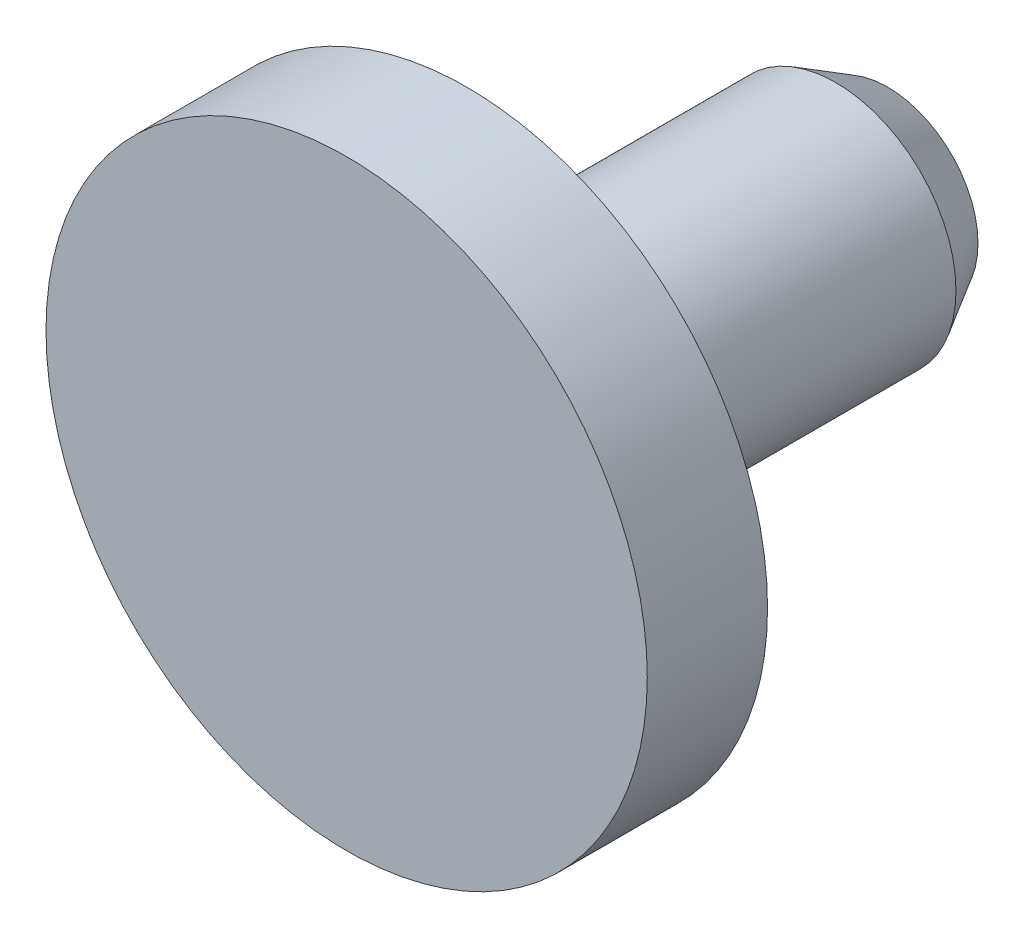
ISO-10303-21;
HEADER;
FILE_DESCRIPTION(('STEP AP214'),'2;1');
FILE_NAME('part.step','',(''),(''),'','','');
FILE_SCHEMA(('AUTOMOTIVE_DESIGN { 1 0 10303 214 1 1 1 1 }'));
ENDSEC;
DATA;
#1=APPLICATION_CONTEXT('core data for automotive mechanical design processes');
#2=APPLICATION_PROTOCOL_DEFINITION('international standard','automotive_design',2000,#1);
#3=PRODUCT_CONTEXT('',#1,'mechanical');
#4=PRODUCT('Part','Part','',(#3));
#5=PRODUCT_RELATED_PRODUCT_CATEGORY('part','',(#4));
#6=PRODUCT_DEFINITION_FORMATION('','',#4);
#7=PRODUCT_DEFINITION_CONTEXT('part definition',#1,'design');
#8=PRODUCT_DEFINITION('design','',#6,#7);
#9=PRODUCT_DEFINITION_SHAPE('','',#8);
#10=(LENGTH_UNIT() NAMED_UNIT(*) SI_UNIT(.MILLI.,.METRE.));
#11=(NAMED_UNIT(*) PLANE_ANGLE_UNIT() SI_UNIT($,.RADIAN.));
#12=(NAMED_UNIT(*) SI_UNIT($,.STERADIAN.) SOLID_ANGLE_UNIT());
#13=UNCERTAINTY_MEASURE_WITH_UNIT(LENGTH_MEASURE(1.E-05),#10,'distance_accuracy_value','');
#14=(GEOMETRIC_REPRESENTATION_CONTEXT(3) GLOBAL_UNCERTAINTY_ASSIGNED_CONTEXT((#13)) GLOBAL_UNIT_ASSIGNED_CONTEXT((#10,
#11,#12)) REPRESENTATION_CONTEXT('',''));
#15=CARTESIAN_POINT('',(0.,0.,0.));
#16=DIRECTION('',(0.,0.,1.));
#17=DIRECTION('',(1.,0.,0.));
#18=AXIS2_PLACEMENT_3D('',#15,#16,#17);
#19=CARTESIAN_POINT('',(0.,0.,2.));
#20=DIRECTION('',(0.,0.,-1.));
#21=DIRECTION('',(-1.,0.,0.));
#22=AXIS2_PLACEMENT_3D('',#19,#20,#21);
#23=CYLINDRICAL_SURFACE('',#22,5.);
#24=CARTESIAN_POINT('',(0.,0.,2.));
#25=DIRECTION('',(0.,0.,1.));
#26=DIRECTION('',(1.,0.,0.));
#27=AXIS2_PLACEMENT_3D('',#24,#25,#26);
#28=CIRCLE('',#27,5.);
#29=CARTESIAN_POINT('',(5.,0.,2.));
#30=VERTEX_POINT('',#29);
#31=EDGE_CURVE('E43',#30,#30,#28,.T.);
#32=ORIENTED_EDGE('',*,*,#31,.F.);
#33=EDGE_LOOP('',(#32));
#34=FACE_BOUND('',#33,.T.);
#35=CARTESIAN_POINT('',(0.,0.,0.));
#36=DIRECTION('',(0.,0.,1.));
#37=DIRECTION('',(1.,0.,0.));
#38=AXIS2_PLACEMENT_3D('',#35,#36,#37);
#39=CIRCLE('',#38,5.);
#40=CARTESIAN_POINT('',(5.,0.,0.));
#41=VERTEX_POINT('',#40);
#42=EDGE_CURVE('E47',#41,#41,#39,.T.);
#43=ORIENTED_EDGE('',*,*,#42,.T.);
#44=EDGE_LOOP('',(#43));
#45=FACE_BOUND('',#44,.T.);
#46=ADVANCED_FACE('F32',(#34,#45),#23,.T.);
#47=CARTESIAN_POINT('',(0.,0.,2.));
#48=DIRECTION('',(0.,0.,1.));
#49=DIRECTION('',(1.,0.,0.));
#50=AXIS2_PLACEMENT_3D('',#47,#48,#49);
#51=PLANE('',#50);
#52=ORIENTED_EDGE('',*,*,#31,.T.);
#53=EDGE_LOOP('',(#52));
#54=FACE_BOUND('',#53,.T.);
#55=ADVANCED_FACE('F68',(#54),#51,.T.);
#56=CARTESIAN_POINT('',(0.,0.,0.));
#57=DIRECTION('',(0.,0.,1.));
#58=DIRECTION('',(1.,0.,0.));
#59=AXIS2_PLACEMENT_3D('',#56,#57,#58);
#60=PLANE('',#59);
#61=CARTESIAN_POINT('',(0.,0.,0.));
#62=DIRECTION('',(0.,0.,1.));
#63=DIRECTION('',(1.,0.,0.));
#64=AXIS2_PLACEMENT_3D('',#61,#62,#63);
#65=CIRCLE('',#64,2.);
#66=CARTESIAN_POINT('',(2.,0.,0.));
#67=VERTEX_POINT('',#66);
#68=EDGE_CURVE('E51',#67,#67,#65,.T.);
#69=ORIENTED_EDGE('',*,*,#68,.T.);
#70=EDGE_LOOP('',(#69));
#71=FACE_BOUND('',#70,.T.);
#72=ORIENTED_EDGE('',*,*,#42,.F.);
#73=EDGE_LOOP('',(#72));
#74=FACE_BOUND('',#73,.T.);
#75=ADVANCED_FACE('F56',(#71,#74),#60,.F.);
#76=CARTESIAN_POINT('',(0.,0.,-7.));
#77=DIRECTION('',(0.,0.,1.));
#78=DIRECTION('',(1.,0.,0.));
#79=AXIS2_PLACEMENT_3D('',#76,#77,#78);
#80=CYLINDRICAL_SURFACE('',#79,2.);
#81=CARTESIAN_POINT('',(0.,0.,-6.13397459621556));
#82=DIRECTION('',(0.,0.,1.));
#83=DIRECTION('',(1.,0.,0.));
#84=AXIS2_PLACEMENT_3D('',#81,#82,#83);
#85=CIRCLE('',#84,2.);
#86=CARTESIAN_POINT('',(2.,0.,-6.13397459621556));
#87=VERTEX_POINT('',#86);
#88=EDGE_CURVE('E39',#87,#87,#85,.T.);
#89=ORIENTED_EDGE('',*,*,#88,.T.);
#90=EDGE_LOOP('',(#89));
#91=FACE_BOUND('',#90,.T.);
#92=ORIENTED_EDGE('',*,*,#68,.F.);
#93=EDGE_LOOP('',(#92));
#94=FACE_BOUND('',#93,.T.);
#95=ADVANCED_FACE('F59',(#91,#94),#80,.T.);
#96=CARTESIAN_POINT('',(0.,0.,-7.));
#97=DIRECTION('',(0.,0.,1.));
#98=DIRECTION('',(1.,0.,0.));
#99=AXIS2_PLACEMENT_3D('',#96,#97,#98);
#100=PLANE('',#99);
#101=CARTESIAN_POINT('',(0.,0.,-7.));
#102=DIRECTION('',(0.,0.,1.));
#103=DIRECTION('',(1.,0.,0.));
#104=AXIS2_PLACEMENT_3D('',#101,#102,#103);
#105=CIRCLE('',#104,1.5);
#106=CARTESIAN_POINT('',(1.5,0.,-7.));
#107=VERTEX_POINT('',#106);
#108=EDGE_CURVE('E10',#107,#107,#105,.F.);
#109=ORIENTED_EDGE('',*,*,#108,.T.);
#110=EDGE_LOOP('',(#109));
#111=FACE_BOUND('',#110,.T.);
#112=ADVANCED_FACE('F61',(#111),#100,.F.);
#113=CARTESIAN_POINT('',(0.,0.,-6.13397459621556));
#114=DIRECTION('',(0.,0.,1.));
#115=DIRECTION('',(1.,0.,0.));
#116=AXIS2_PLACEMENT_3D('',#113,#114,#115);
#117=CONICAL_SURFACE('',#116,2.,0.5235987755983);
#118=ORIENTED_EDGE('',*,*,#108,.F.);
#119=EDGE_LOOP('',(#118));
#120=FACE_BOUND('',#119,.T.);
#121=ORIENTED_EDGE('',*,*,#88,.F.);
#122=EDGE_LOOP('',(#121));
#123=FACE_BOUND('',#122,.T.);
#124=ADVANCED_FACE('F34',(#120,#123),#117,.T.);
#125=CLOSED_SHELL('',(#46,#55,#75,#95,#112,#124));
#126=MANIFOLD_SOLID_BREP('B2',#125);
#127=ADVANCED_BREP_SHAPE_REPRESENTATION('',(#18,#126),#14);
#128=SHAPE_DEFINITION_REPRESENTATION(#9,#127);
ENDSEC;
END-ISO-10303-21;
